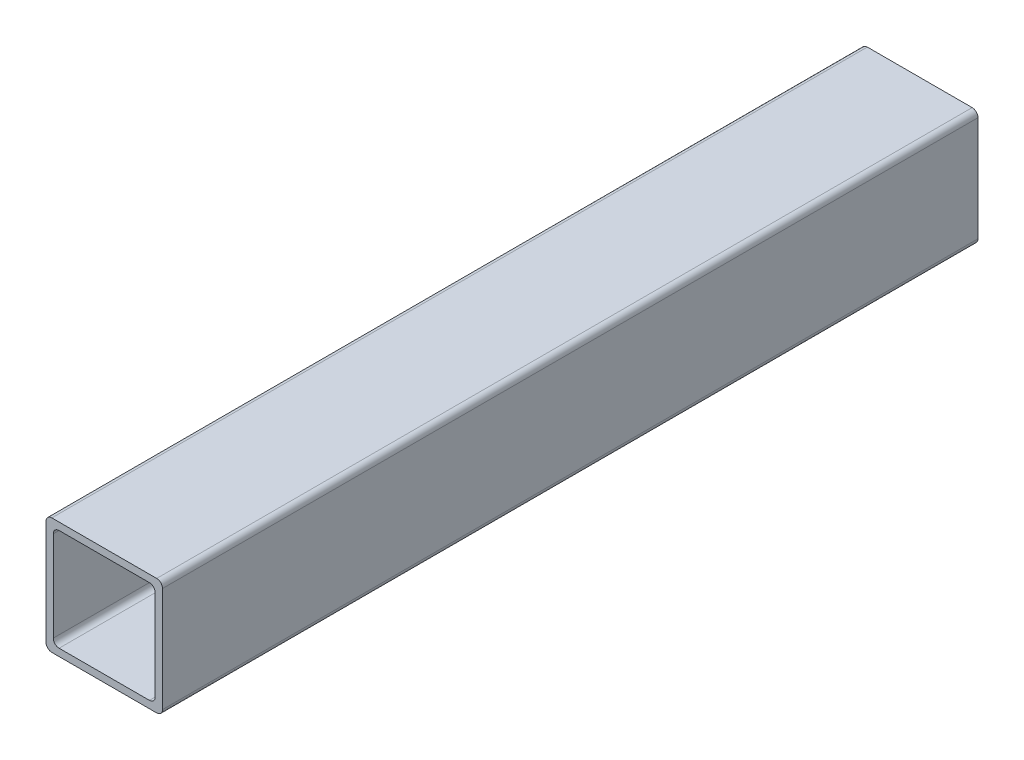
ISO-10303-21;
HEADER;
FILE_DESCRIPTION(('STEP AP214'),'2;1');
FILE_NAME('part.step','',(''),(''),'','','');
FILE_SCHEMA(('AUTOMOTIVE_DESIGN { 1 0 10303 214 1 1 1 1 }'));
ENDSEC;
DATA;
#1=APPLICATION_CONTEXT('core data for automotive mechanical design processes');
#2=APPLICATION_PROTOCOL_DEFINITION('international standard','automotive_design',2000,#1);
#3=PRODUCT_CONTEXT('',#1,'mechanical');
#4=PRODUCT('Part','Part','',(#3));
#5=PRODUCT_RELATED_PRODUCT_CATEGORY('part','',(#4));
#6=PRODUCT_DEFINITION_FORMATION('','',#4);
#7=PRODUCT_DEFINITION_CONTEXT('part definition',#1,'design');
#8=PRODUCT_DEFINITION('design','',#6,#7);
#9=PRODUCT_DEFINITION_SHAPE('','',#8);
#10=(LENGTH_UNIT() NAMED_UNIT(*) SI_UNIT(.MILLI.,.METRE.));
#11=(NAMED_UNIT(*) PLANE_ANGLE_UNIT() SI_UNIT($,.RADIAN.));
#12=(NAMED_UNIT(*) SI_UNIT($,.STERADIAN.) SOLID_ANGLE_UNIT());
#13=UNCERTAINTY_MEASURE_WITH_UNIT(LENGTH_MEASURE(1.E-05),#10,'distance_accuracy_value','');
#14=(GEOMETRIC_REPRESENTATION_CONTEXT(3) GLOBAL_UNCERTAINTY_ASSIGNED_CONTEXT((#13)) GLOBAL_UNIT_ASSIGNED_CONTEXT((#10,
#11,#12)) REPRESENTATION_CONTEXT('',''));
#15=CARTESIAN_POINT('',(0.,0.,0.));
#16=DIRECTION('',(0.,0.,1.));
#17=DIRECTION('',(1.,0.,0.));
#18=AXIS2_PLACEMENT_3D('',#15,#16,#17);
#19=CARTESIAN_POINT('',(22.86,-22.86,177.8));
#20=DIRECTION('',(0.,0.,1.));
#21=DIRECTION('',(1.,0.,0.));
#22=AXIS2_PLACEMENT_3D('',#19,#20,#21);
#23=PLANE('',#22);
#24=CARTESIAN_POINT('',(22.86,-22.86,177.8));
#25=DIRECTION('',(0.,0.,1.));
#26=DIRECTION('',(1.,0.,0.));
#27=AXIS2_PLACEMENT_3D('',#24,#25,#26);
#28=CIRCLE('',#27,2.54);
#29=CARTESIAN_POINT('',(22.86,-25.4,177.8));
#30=VERTEX_POINT('',#29);
#31=CARTESIAN_POINT('',(25.4,-22.86,177.8));
#32=VERTEX_POINT('',#31);
#33=EDGE_CURVE('E211',#30,#32,#28,.T.);
#34=ORIENTED_EDGE('',*,*,#33,.T.);
#35=DIRECTION('',(0.,1.,0.));
#36=VECTOR('',#35,1.);
#37=CARTESIAN_POINT('',(25.4,-22.86,177.8));
#38=LINE('',#37,#36);
#39=CARTESIAN_POINT('',(25.4,22.86,177.8));
#40=VERTEX_POINT('',#39);
#41=EDGE_CURVE('E214',#32,#40,#38,.T.);
#42=ORIENTED_EDGE('',*,*,#41,.T.);
#43=CARTESIAN_POINT('',(22.86,22.86,177.8));
#44=DIRECTION('',(0.,0.,1.));
#45=DIRECTION('',(-1.,0.,0.));
#46=AXIS2_PLACEMENT_3D('',#43,#44,#45);
#47=CIRCLE('',#46,2.54);
#48=CARTESIAN_POINT('',(22.86,25.4,177.8));
#49=VERTEX_POINT('',#48);
#50=EDGE_CURVE('E217',#40,#49,#47,.T.);
#51=ORIENTED_EDGE('',*,*,#50,.T.);
#52=DIRECTION('',(-1.,0.,0.));
#53=VECTOR('',#52,1.);
#54=CARTESIAN_POINT('',(-22.86,25.4,177.8));
#55=LINE('',#54,#53);
#56=CARTESIAN_POINT('',(-22.86,25.4,177.8));
#57=VERTEX_POINT('',#56);
#58=EDGE_CURVE('E219',#49,#57,#55,.T.);
#59=ORIENTED_EDGE('',*,*,#58,.T.);
#60=CARTESIAN_POINT('',(-22.86,22.86,177.8));
#61=DIRECTION('',(0.,0.,1.));
#62=DIRECTION('',(-1.,0.,0.));
#63=AXIS2_PLACEMENT_3D('',#60,#61,#62);
#64=CIRCLE('',#63,2.54);
#65=CARTESIAN_POINT('',(-25.4,22.86,177.8));
#66=VERTEX_POINT('',#65);
#67=EDGE_CURVE('E221',#57,#66,#64,.T.);
#68=ORIENTED_EDGE('',*,*,#67,.T.);
#69=DIRECTION('',(0.,-1.,0.));
#70=VECTOR('',#69,1.);
#71=CARTESIAN_POINT('',(-25.4,-22.86,177.8));
#72=LINE('',#71,#70);
#73=CARTESIAN_POINT('',(-25.4,-22.86,177.8));
#74=VERTEX_POINT('',#73);
#75=EDGE_CURVE('E223',#66,#74,#72,.T.);
#76=ORIENTED_EDGE('',*,*,#75,.T.);
#77=CARTESIAN_POINT('',(-22.86,-22.86,177.8));
#78=DIRECTION('',(0.,0.,1.));
#79=DIRECTION('',(-1.,0.,0.));
#80=AXIS2_PLACEMENT_3D('',#77,#78,#79);
#81=CIRCLE('',#80,2.54);
#82=CARTESIAN_POINT('',(-22.86,-25.4,177.8));
#83=VERTEX_POINT('',#82);
#84=EDGE_CURVE('E225',#74,#83,#81,.T.);
#85=ORIENTED_EDGE('',*,*,#84,.T.);
#86=DIRECTION('',(1.,0.,0.));
#87=VECTOR('',#86,1.);
#88=CARTESIAN_POINT('',(-22.86,-25.4,177.8));
#89=LINE('',#88,#87);
#90=EDGE_CURVE('E227',#83,#30,#89,.T.);
#91=ORIENTED_EDGE('',*,*,#90,.T.);
#92=EDGE_LOOP('',(#34,#42,#51,#59,#68,#76,#85,#91));
#93=FACE_BOUND('',#92,.T.);
#94=DIRECTION('',(-1.,0.,0.));
#95=VECTOR('',#94,1.);
#96=CARTESIAN_POINT('',(-19.685,22.225,177.8));
#97=LINE('',#96,#95);
#98=CARTESIAN_POINT('',(19.685,22.225,177.8));
#99=VERTEX_POINT('',#98);
#100=CARTESIAN_POINT('',(-19.685,22.225,177.8));
#101=VERTEX_POINT('',#100);
#102=EDGE_CURVE('E154',#99,#101,#97,.T.);
#103=ORIENTED_EDGE('',*,*,#102,.F.);
#104=CARTESIAN_POINT('',(19.685,19.685,177.8));
#105=DIRECTION('',(0.,0.,1.));
#106=DIRECTION('',(-1.,0.,0.));
#107=AXIS2_PLACEMENT_3D('',#104,#105,#106);
#108=CIRCLE('',#107,2.54);
#109=CARTESIAN_POINT('',(22.225,19.685,177.8));
#110=VERTEX_POINT('',#109);
#111=EDGE_CURVE('E146',#110,#99,#108,.T.);
#112=ORIENTED_EDGE('',*,*,#111,.F.);
#113=DIRECTION('',(0.,1.,0.));
#114=VECTOR('',#113,1.);
#115=CARTESIAN_POINT('',(22.225,-19.685,177.8));
#116=LINE('',#115,#114);
#117=CARTESIAN_POINT('',(22.225,-19.685,177.8));
#118=VERTEX_POINT('',#117);
#119=EDGE_CURVE('E179',#118,#110,#116,.T.);
#120=ORIENTED_EDGE('',*,*,#119,.F.);
#121=CARTESIAN_POINT('',(19.685,-19.685,177.8));
#122=DIRECTION('',(0.,0.,1.));
#123=DIRECTION('',(-1.,0.,0.));
#124=AXIS2_PLACEMENT_3D('',#121,#122,#123);
#125=CIRCLE('',#124,2.54);
#126=CARTESIAN_POINT('',(19.685,-22.225,177.8));
#127=VERTEX_POINT('',#126);
#128=EDGE_CURVE('E177',#127,#118,#125,.T.);
#129=ORIENTED_EDGE('',*,*,#128,.F.);
#130=DIRECTION('',(1.,0.,0.));
#131=VECTOR('',#130,1.);
#132=CARTESIAN_POINT('',(-19.685,-22.225,177.8));
#133=LINE('',#132,#131);
#134=CARTESIAN_POINT('',(-19.685,-22.225,177.8));
#135=VERTEX_POINT('',#134);
#136=EDGE_CURVE('E175',#135,#127,#133,.T.);
#137=ORIENTED_EDGE('',*,*,#136,.F.);
#138=CARTESIAN_POINT('',(-19.685,-19.685,177.8));
#139=DIRECTION('',(0.,0.,1.));
#140=DIRECTION('',(-1.,0.,0.));
#141=AXIS2_PLACEMENT_3D('',#138,#139,#140);
#142=CIRCLE('',#141,2.54);
#143=CARTESIAN_POINT('',(-22.225,-19.685,177.8));
#144=VERTEX_POINT('',#143);
#145=EDGE_CURVE('E173',#144,#135,#142,.T.);
#146=ORIENTED_EDGE('',*,*,#145,.F.);
#147=DIRECTION('',(0.,-1.,0.));
#148=VECTOR('',#147,1.);
#149=CARTESIAN_POINT('',(-22.225,-19.685,177.8));
#150=LINE('',#149,#148);
#151=CARTESIAN_POINT('',(-22.225,19.685,177.8));
#152=VERTEX_POINT('',#151);
#153=EDGE_CURVE('E169',#152,#144,#150,.T.);
#154=ORIENTED_EDGE('',*,*,#153,.F.);
#155=CARTESIAN_POINT('',(-19.685,19.685,177.8));
#156=DIRECTION('',(0.,0.,1.));
#157=DIRECTION('',(1.,0.,0.));
#158=AXIS2_PLACEMENT_3D('',#155,#156,#157);
#159=CIRCLE('',#158,2.54);
#160=EDGE_CURVE('E167',#101,#152,#159,.T.);
#161=ORIENTED_EDGE('',*,*,#160,.F.);
#162=EDGE_LOOP('',(#103,#112,#120,#129,#137,#146,#154,#161));
#163=FACE_BOUND('',#162,.T.);
#164=ADVANCED_FACE('F33',(#93,#163),#23,.T.);
#165=CARTESIAN_POINT('',(22.86,-22.86,-177.8));
#166=DIRECTION('',(0.,0.,1.));
#167=DIRECTION('',(1.,0.,0.));
#168=AXIS2_PLACEMENT_3D('',#165,#166,#167);
#169=PLANE('',#168);
#170=CARTESIAN_POINT('',(22.86,-22.86,-177.8));
#171=DIRECTION('',(0.,0.,1.));
#172=DIRECTION('',(1.,0.,0.));
#173=AXIS2_PLACEMENT_3D('',#170,#171,#172);
#174=CIRCLE('',#173,2.54);
#175=CARTESIAN_POINT('',(22.86,-25.4,-177.8));
#176=VERTEX_POINT('',#175);
#177=CARTESIAN_POINT('',(25.4,-22.86,-177.8));
#178=VERTEX_POINT('',#177);
#179=EDGE_CURVE('E162',#176,#178,#174,.T.);
#180=ORIENTED_EDGE('',*,*,#179,.F.);
#181=DIRECTION('',(1.,0.,0.));
#182=VECTOR('',#181,1.);
#183=CARTESIAN_POINT('',(-22.86,-25.4,-177.8));
#184=LINE('',#183,#182);
#185=CARTESIAN_POINT('',(-22.86,-25.4,-177.8));
#186=VERTEX_POINT('',#185);
#187=EDGE_CURVE('E215',#186,#176,#184,.T.);
#188=ORIENTED_EDGE('',*,*,#187,.F.);
#189=CARTESIAN_POINT('',(-22.86,-22.86,-177.8));
#190=DIRECTION('',(0.,0.,1.));
#191=DIRECTION('',(-1.,0.,0.));
#192=AXIS2_PLACEMENT_3D('',#189,#190,#191);
#193=CIRCLE('',#192,2.54);
#194=CARTESIAN_POINT('',(-25.4,-22.86,-177.8));
#195=VERTEX_POINT('',#194);
#196=EDGE_CURVE('E242',#195,#186,#193,.T.);
#197=ORIENTED_EDGE('',*,*,#196,.F.);
#198=DIRECTION('',(0.,-1.,0.));
#199=VECTOR('',#198,1.);
#200=CARTESIAN_POINT('',(-25.4,-22.86,-177.8));
#201=LINE('',#200,#199);
#202=CARTESIAN_POINT('',(-25.4,22.86,-177.8));
#203=VERTEX_POINT('',#202);
#204=EDGE_CURVE('E240',#203,#195,#201,.T.);
#205=ORIENTED_EDGE('',*,*,#204,.F.);
#206=CARTESIAN_POINT('',(-22.86,22.86,-177.8));
#207=DIRECTION('',(0.,0.,1.));
#208=DIRECTION('',(-1.,0.,0.));
#209=AXIS2_PLACEMENT_3D('',#206,#207,#208);
#210=CIRCLE('',#209,2.54);
#211=CARTESIAN_POINT('',(-22.86,25.4,-177.8));
#212=VERTEX_POINT('',#211);
#213=EDGE_CURVE('E238',#212,#203,#210,.T.);
#214=ORIENTED_EDGE('',*,*,#213,.F.);
#215=DIRECTION('',(-1.,0.,0.));
#216=VECTOR('',#215,1.);
#217=CARTESIAN_POINT('',(-22.86,25.4,-177.8));
#218=LINE('',#217,#216);
#219=CARTESIAN_POINT('',(22.86,25.4,-177.8));
#220=VERTEX_POINT('',#219);
#221=EDGE_CURVE('E236',#220,#212,#218,.T.);
#222=ORIENTED_EDGE('',*,*,#221,.F.);
#223=CARTESIAN_POINT('',(22.86,22.86,-177.8));
#224=DIRECTION('',(0.,0.,1.));
#225=DIRECTION('',(-1.,0.,0.));
#226=AXIS2_PLACEMENT_3D('',#223,#224,#225);
#227=CIRCLE('',#226,2.54);
#228=CARTESIAN_POINT('',(25.4,22.86,-177.8));
#229=VERTEX_POINT('',#228);
#230=EDGE_CURVE('E234',#229,#220,#227,.T.);
#231=ORIENTED_EDGE('',*,*,#230,.F.);
#232=DIRECTION('',(0.,1.,0.));
#233=VECTOR('',#232,1.);
#234=CARTESIAN_POINT('',(25.4,-22.86,-177.8));
#235=LINE('',#234,#233);
#236=EDGE_CURVE('E232',#178,#229,#235,.T.);
#237=ORIENTED_EDGE('',*,*,#236,.F.);
#238=EDGE_LOOP('',(#180,#188,#197,#205,#214,#222,#231,#237));
#239=FACE_BOUND('',#238,.T.);
#240=CARTESIAN_POINT('',(19.685,19.685,-177.8));
#241=DIRECTION('',(0.,0.,1.));
#242=DIRECTION('',(-1.,0.,0.));
#243=AXIS2_PLACEMENT_3D('',#240,#241,#242);
#244=CIRCLE('',#243,2.54);
#245=CARTESIAN_POINT('',(22.225,19.685,-177.8));
#246=VERTEX_POINT('',#245);
#247=CARTESIAN_POINT('',(19.685,22.225,-177.8));
#248=VERTEX_POINT('',#247);
#249=EDGE_CURVE('E56',#246,#248,#244,.T.);
#250=ORIENTED_EDGE('',*,*,#249,.T.);
#251=DIRECTION('',(-1.,0.,0.));
#252=VECTOR('',#251,1.);
#253=CARTESIAN_POINT('',(-19.685,22.225,-177.8));
#254=LINE('',#253,#252);
#255=CARTESIAN_POINT('',(-19.685,22.225,-177.8));
#256=VERTEX_POINT('',#255);
#257=EDGE_CURVE('E161',#248,#256,#254,.T.);
#258=ORIENTED_EDGE('',*,*,#257,.T.);
#259=CARTESIAN_POINT('',(-19.685,19.685,-177.8));
#260=DIRECTION('',(0.,0.,1.));
#261=DIRECTION('',(1.,0.,0.));
#262=AXIS2_PLACEMENT_3D('',#259,#260,#261);
#263=CIRCLE('',#262,2.54);
#264=CARTESIAN_POINT('',(-22.225,19.685,-177.8));
#265=VERTEX_POINT('',#264);
#266=EDGE_CURVE('E183',#256,#265,#263,.T.);
#267=ORIENTED_EDGE('',*,*,#266,.T.);
#268=DIRECTION('',(0.,-1.,0.));
#269=VECTOR('',#268,1.);
#270=CARTESIAN_POINT('',(-22.225,-19.685,-177.8));
#271=LINE('',#270,#269);
#272=CARTESIAN_POINT('',(-22.225,-19.685,-177.8));
#273=VERTEX_POINT('',#272);
#274=EDGE_CURVE('E186',#265,#273,#271,.T.);
#275=ORIENTED_EDGE('',*,*,#274,.T.);
#276=CARTESIAN_POINT('',(-19.685,-19.685,-177.8));
#277=DIRECTION('',(0.,0.,1.));
#278=DIRECTION('',(-1.,0.,0.));
#279=AXIS2_PLACEMENT_3D('',#276,#277,#278);
#280=CIRCLE('',#279,2.54);
#281=CARTESIAN_POINT('',(-19.685,-22.225,-177.8));
#282=VERTEX_POINT('',#281);
#283=EDGE_CURVE('E189',#273,#282,#280,.T.);
#284=ORIENTED_EDGE('',*,*,#283,.T.);
#285=DIRECTION('',(1.,0.,0.));
#286=VECTOR('',#285,1.);
#287=CARTESIAN_POINT('',(-19.685,-22.225,-177.8));
#288=LINE('',#287,#286);
#289=CARTESIAN_POINT('',(19.685,-22.225,-177.8));
#290=VERTEX_POINT('',#289);
#291=EDGE_CURVE('E192',#282,#290,#288,.T.);
#292=ORIENTED_EDGE('',*,*,#291,.T.);
#293=CARTESIAN_POINT('',(19.685,-19.685,-177.8));
#294=DIRECTION('',(0.,0.,1.));
#295=DIRECTION('',(-1.,0.,0.));
#296=AXIS2_PLACEMENT_3D('',#293,#294,#295);
#297=CIRCLE('',#296,2.54);
#298=CARTESIAN_POINT('',(22.225,-19.685,-177.8));
#299=VERTEX_POINT('',#298);
#300=EDGE_CURVE('E195',#290,#299,#297,.T.);
#301=ORIENTED_EDGE('',*,*,#300,.T.);
#302=DIRECTION('',(0.,1.,0.));
#303=VECTOR('',#302,1.);
#304=CARTESIAN_POINT('',(22.225,-19.685,-177.8));
#305=LINE('',#304,#303);
#306=EDGE_CURVE('E155',#299,#246,#305,.T.);
#307=ORIENTED_EDGE('',*,*,#306,.T.);
#308=EDGE_LOOP('',(#250,#258,#267,#275,#284,#292,#301,#307));
#309=FACE_BOUND('',#308,.T.);
#310=ADVANCED_FACE('F272',(#239,#309),#169,.F.);
#311=CARTESIAN_POINT('',(22.86,-22.86,177.8));
#312=DIRECTION('',(0.,0.,-1.));
#313=DIRECTION('',(-1.,0.,0.));
#314=AXIS2_PLACEMENT_3D('',#311,#312,#313);
#315=CYLINDRICAL_SURFACE('',#314,2.54);
#316=ORIENTED_EDGE('',*,*,#179,.T.);
#317=DIRECTION('',(0.,0.,-1.));
#318=VECTOR('',#317,1.);
#319=CARTESIAN_POINT('',(25.4,-22.86,177.8));
#320=LINE('',#319,#318);
#321=EDGE_CURVE('E11',#32,#178,#320,.T.);
#322=ORIENTED_EDGE('',*,*,#321,.F.);
#323=ORIENTED_EDGE('',*,*,#33,.F.);
#324=DIRECTION('',(0.,0.,-1.));
#325=VECTOR('',#324,1.);
#326=CARTESIAN_POINT('',(22.86,-25.4,177.8));
#327=LINE('',#326,#325);
#328=EDGE_CURVE('E229',#30,#176,#327,.T.);
#329=ORIENTED_EDGE('',*,*,#328,.T.);
#330=EDGE_LOOP('',(#316,#322,#323,#329));
#331=FACE_BOUND('',#330,.T.);
#332=ADVANCED_FACE('F35',(#331),#315,.T.);
#333=CARTESIAN_POINT('',(25.4,-22.86,177.8));
#334=DIRECTION('',(-1.,0.,0.));
#335=DIRECTION('',(0.,0.,1.));
#336=AXIS2_PLACEMENT_3D('',#333,#334,#335);
#337=PLANE('',#336);
#338=ORIENTED_EDGE('',*,*,#236,.T.);
#339=DIRECTION('',(0.,0.,-1.));
#340=VECTOR('',#339,1.);
#341=CARTESIAN_POINT('',(25.4,22.86,177.8));
#342=LINE('',#341,#340);
#343=EDGE_CURVE('E41',#40,#229,#342,.T.);
#344=ORIENTED_EDGE('',*,*,#343,.F.);
#345=ORIENTED_EDGE('',*,*,#41,.F.);
#346=ORIENTED_EDGE('',*,*,#321,.T.);
#347=EDGE_LOOP('',(#338,#344,#345,#346));
#348=FACE_BOUND('',#347,.T.);
#349=ADVANCED_FACE('F289',(#348),#337,.F.);
#350=CARTESIAN_POINT('',(22.86,22.86,177.8));
#351=DIRECTION('',(0.,0.,-1.));
#352=DIRECTION('',(-1.,0.,0.));
#353=AXIS2_PLACEMENT_3D('',#350,#351,#352);
#354=CYLINDRICAL_SURFACE('',#353,2.54);
#355=ORIENTED_EDGE('',*,*,#230,.T.);
#356=DIRECTION('',(0.,0.,-1.));
#357=VECTOR('',#356,1.);
#358=CARTESIAN_POINT('',(22.86,25.4,177.8));
#359=LINE('',#358,#357);
#360=EDGE_CURVE('E259',#49,#220,#359,.T.);
#361=ORIENTED_EDGE('',*,*,#360,.F.);
#362=ORIENTED_EDGE('',*,*,#50,.F.);
#363=ORIENTED_EDGE('',*,*,#343,.T.);
#364=EDGE_LOOP('',(#355,#361,#362,#363));
#365=FACE_BOUND('',#364,.T.);
#366=ADVANCED_FACE('F266',(#365),#354,.T.);
#367=CARTESIAN_POINT('',(-22.86,25.4,177.8));
#368=DIRECTION('',(0.,-1.,0.));
#369=DIRECTION('',(0.,0.,-1.));
#370=AXIS2_PLACEMENT_3D('',#367,#368,#369);
#371=PLANE('',#370);
#372=ORIENTED_EDGE('',*,*,#221,.T.);
#373=DIRECTION('',(0.,0.,-1.));
#374=VECTOR('',#373,1.);
#375=CARTESIAN_POINT('',(-22.86,25.4,177.8));
#376=LINE('',#375,#374);
#377=EDGE_CURVE('E256',#57,#212,#376,.T.);
#378=ORIENTED_EDGE('',*,*,#377,.F.);
#379=ORIENTED_EDGE('',*,*,#58,.F.);
#380=ORIENTED_EDGE('',*,*,#360,.T.);
#381=EDGE_LOOP('',(#372,#378,#379,#380));
#382=FACE_BOUND('',#381,.T.);
#383=ADVANCED_FACE('F278',(#382),#371,.F.);
#384=CARTESIAN_POINT('',(-22.86,22.86,177.8));
#385=DIRECTION('',(0.,0.,-1.));
#386=DIRECTION('',(-1.,0.,0.));
#387=AXIS2_PLACEMENT_3D('',#384,#385,#386);
#388=CYLINDRICAL_SURFACE('',#387,2.54);
#389=ORIENTED_EDGE('',*,*,#213,.T.);
#390=DIRECTION('',(0.,0.,-1.));
#391=VECTOR('',#390,1.);
#392=CARTESIAN_POINT('',(-25.4,22.86,177.8));
#393=LINE('',#392,#391);
#394=EDGE_CURVE('E253',#66,#203,#393,.T.);
#395=ORIENTED_EDGE('',*,*,#394,.F.);
#396=ORIENTED_EDGE('',*,*,#67,.F.);
#397=ORIENTED_EDGE('',*,*,#377,.T.);
#398=EDGE_LOOP('',(#389,#395,#396,#397));
#399=FACE_BOUND('',#398,.T.);
#400=ADVANCED_FACE('F282',(#399),#388,.T.);
#401=CARTESIAN_POINT('',(-25.4,-22.86,177.8));
#402=DIRECTION('',(1.,0.,0.));
#403=DIRECTION('',(0.,0.,-1.));
#404=AXIS2_PLACEMENT_3D('',#401,#402,#403);
#405=PLANE('',#404);
#406=ORIENTED_EDGE('',*,*,#204,.T.);
#407=DIRECTION('',(0.,0.,-1.));
#408=VECTOR('',#407,1.);
#409=CARTESIAN_POINT('',(-25.4,-22.86,177.8));
#410=LINE('',#409,#408);
#411=EDGE_CURVE('E250',#74,#195,#410,.T.);
#412=ORIENTED_EDGE('',*,*,#411,.F.);
#413=ORIENTED_EDGE('',*,*,#75,.F.);
#414=ORIENTED_EDGE('',*,*,#394,.T.);
#415=EDGE_LOOP('',(#406,#412,#413,#414));
#416=FACE_BOUND('',#415,.T.);
#417=ADVANCED_FACE('F302',(#416),#405,.F.);
#418=CARTESIAN_POINT('',(-22.86,-22.86,177.8));
#419=DIRECTION('',(0.,0.,-1.));
#420=DIRECTION('',(-1.,0.,0.));
#421=AXIS2_PLACEMENT_3D('',#418,#419,#420);
#422=CYLINDRICAL_SURFACE('',#421,2.54);
#423=ORIENTED_EDGE('',*,*,#196,.T.);
#424=DIRECTION('',(0.,0.,-1.));
#425=VECTOR('',#424,1.);
#426=CARTESIAN_POINT('',(-22.86,-25.4,177.8));
#427=LINE('',#426,#425);
#428=EDGE_CURVE('E247',#83,#186,#427,.T.);
#429=ORIENTED_EDGE('',*,*,#428,.F.);
#430=ORIENTED_EDGE('',*,*,#84,.F.);
#431=ORIENTED_EDGE('',*,*,#411,.T.);
#432=EDGE_LOOP('',(#423,#429,#430,#431));
#433=FACE_BOUND('',#432,.T.);
#434=ADVANCED_FACE('F300',(#433),#422,.T.);
#435=CARTESIAN_POINT('',(-22.86,-25.4,177.8));
#436=DIRECTION('',(0.,1.,0.));
#437=DIRECTION('',(0.,0.,1.));
#438=AXIS2_PLACEMENT_3D('',#435,#436,#437);
#439=PLANE('',#438);
#440=ORIENTED_EDGE('',*,*,#187,.T.);
#441=ORIENTED_EDGE('',*,*,#328,.F.);
#442=ORIENTED_EDGE('',*,*,#90,.F.);
#443=ORIENTED_EDGE('',*,*,#428,.T.);
#444=EDGE_LOOP('',(#440,#441,#442,#443));
#445=FACE_BOUND('',#444,.T.);
#446=ADVANCED_FACE('F295',(#445),#439,.F.);
#447=CARTESIAN_POINT('',(19.685,19.685,177.8));
#448=DIRECTION('',(0.,0.,-1.));
#449=DIRECTION('',(-1.,0.,0.));
#450=AXIS2_PLACEMENT_3D('',#447,#448,#449);
#451=CYLINDRICAL_SURFACE('',#450,2.54);
#452=ORIENTED_EDGE('',*,*,#249,.F.);
#453=DIRECTION('',(0.,0.,-1.));
#454=VECTOR('',#453,1.);
#455=CARTESIAN_POINT('',(22.225,19.685,177.8));
#456=LINE('',#455,#454);
#457=EDGE_CURVE('E150',#110,#246,#456,.T.);
#458=ORIENTED_EDGE('',*,*,#457,.F.);
#459=ORIENTED_EDGE('',*,*,#111,.T.);
#460=DIRECTION('',(0.,0.,-1.));
#461=VECTOR('',#460,1.);
#462=CARTESIAN_POINT('',(19.685,22.225,177.8));
#463=LINE('',#462,#461);
#464=EDGE_CURVE('E149',#99,#248,#463,.T.);
#465=ORIENTED_EDGE('',*,*,#464,.T.);
#466=EDGE_LOOP('',(#452,#458,#459,#465));
#467=FACE_BOUND('',#466,.T.);
#468=ADVANCED_FACE('F148',(#467),#451,.F.);
#469=CARTESIAN_POINT('',(-19.685,22.225,177.8));
#470=DIRECTION('',(0.,-1.,0.));
#471=DIRECTION('',(1.,0.,0.));
#472=AXIS2_PLACEMENT_3D('',#469,#470,#471);
#473=PLANE('',#472);
#474=ORIENTED_EDGE('',*,*,#257,.F.);
#475=ORIENTED_EDGE('',*,*,#464,.F.);
#476=ORIENTED_EDGE('',*,*,#102,.T.);
#477=DIRECTION('',(0.,0.,-1.));
#478=VECTOR('',#477,1.);
#479=CARTESIAN_POINT('',(-19.685,22.225,177.8));
#480=LINE('',#479,#478);
#481=EDGE_CURVE('E163',#101,#256,#480,.T.);
#482=ORIENTED_EDGE('',*,*,#481,.T.);
#483=EDGE_LOOP('',(#474,#475,#476,#482));
#484=FACE_BOUND('',#483,.T.);
#485=ADVANCED_FACE('F158',(#484),#473,.T.);
#486=CARTESIAN_POINT('',(-19.685,19.685,177.8));
#487=DIRECTION('',(0.,0.,-1.));
#488=DIRECTION('',(-1.,0.,0.));
#489=AXIS2_PLACEMENT_3D('',#486,#487,#488);
#490=CYLINDRICAL_SURFACE('',#489,2.54);
#491=ORIENTED_EDGE('',*,*,#266,.F.);
#492=ORIENTED_EDGE('',*,*,#481,.F.);
#493=ORIENTED_EDGE('',*,*,#160,.T.);
#494=DIRECTION('',(0.,0.,-1.));
#495=VECTOR('',#494,1.);
#496=CARTESIAN_POINT('',(-22.225,19.685,177.8));
#497=LINE('',#496,#495);
#498=EDGE_CURVE('E208',#152,#265,#497,.T.);
#499=ORIENTED_EDGE('',*,*,#498,.T.);
#500=EDGE_LOOP('',(#491,#492,#493,#499));
#501=FACE_BOUND('',#500,.T.);
#502=ADVANCED_FACE('F327',(#501),#490,.F.);
#503=CARTESIAN_POINT('',(-22.225,-19.685,177.8));
#504=DIRECTION('',(1.,0.,0.));
#505=DIRECTION('',(0.,0.,-1.));
#506=AXIS2_PLACEMENT_3D('',#503,#504,#505);
#507=PLANE('',#506);
#508=ORIENTED_EDGE('',*,*,#274,.F.);
#509=ORIENTED_EDGE('',*,*,#498,.F.);
#510=ORIENTED_EDGE('',*,*,#153,.T.);
#511=DIRECTION('',(0.,0.,-1.));
#512=VECTOR('',#511,1.);
#513=CARTESIAN_POINT('',(-22.225,-19.685,177.8));
#514=LINE('',#513,#512);
#515=EDGE_CURVE('E206',#144,#273,#514,.T.);
#516=ORIENTED_EDGE('',*,*,#515,.T.);
#517=EDGE_LOOP('',(#508,#509,#510,#516));
#518=FACE_BOUND('',#517,.T.);
#519=ADVANCED_FACE('F331',(#518),#507,.T.);
#520=CARTESIAN_POINT('',(-19.685,-19.685,177.8));
#521=DIRECTION('',(0.,0.,-1.));
#522=DIRECTION('',(-1.,0.,0.));
#523=AXIS2_PLACEMENT_3D('',#520,#521,#522);
#524=CYLINDRICAL_SURFACE('',#523,2.54);
#525=ORIENTED_EDGE('',*,*,#283,.F.);
#526=ORIENTED_EDGE('',*,*,#515,.F.);
#527=ORIENTED_EDGE('',*,*,#145,.T.);
#528=DIRECTION('',(0.,0.,-1.));
#529=VECTOR('',#528,1.);
#530=CARTESIAN_POINT('',(-19.685,-22.225,177.8));
#531=LINE('',#530,#529);
#532=EDGE_CURVE('E204',#135,#282,#531,.T.);
#533=ORIENTED_EDGE('',*,*,#532,.T.);
#534=EDGE_LOOP('',(#525,#526,#527,#533));
#535=FACE_BOUND('',#534,.T.);
#536=ADVANCED_FACE('F337',(#535),#524,.F.);
#537=CARTESIAN_POINT('',(-19.685,-22.225,177.8));
#538=DIRECTION('',(0.,1.,0.));
#539=DIRECTION('',(0.,0.,1.));
#540=AXIS2_PLACEMENT_3D('',#537,#538,#539);
#541=PLANE('',#540);
#542=ORIENTED_EDGE('',*,*,#291,.F.);
#543=ORIENTED_EDGE('',*,*,#532,.F.);
#544=ORIENTED_EDGE('',*,*,#136,.T.);
#545=DIRECTION('',(0.,0.,-1.));
#546=VECTOR('',#545,1.);
#547=CARTESIAN_POINT('',(19.685,-22.225,177.8));
#548=LINE('',#547,#546);
#549=EDGE_CURVE('E202',#127,#290,#548,.T.);
#550=ORIENTED_EDGE('',*,*,#549,.T.);
#551=EDGE_LOOP('',(#542,#543,#544,#550));
#552=FACE_BOUND('',#551,.T.);
#553=ADVANCED_FACE('F341',(#552),#541,.T.);
#554=CARTESIAN_POINT('',(19.685,-19.685,177.8));
#555=DIRECTION('',(0.,0.,-1.));
#556=DIRECTION('',(-1.,0.,0.));
#557=AXIS2_PLACEMENT_3D('',#554,#555,#556);
#558=CYLINDRICAL_SURFACE('',#557,2.54);
#559=ORIENTED_EDGE('',*,*,#300,.F.);
#560=ORIENTED_EDGE('',*,*,#549,.F.);
#561=ORIENTED_EDGE('',*,*,#128,.T.);
#562=DIRECTION('',(0.,0.,-1.));
#563=VECTOR('',#562,1.);
#564=CARTESIAN_POINT('',(22.225,-19.685,177.8));
#565=LINE('',#564,#563);
#566=EDGE_CURVE('E48',#118,#299,#565,.T.);
#567=ORIENTED_EDGE('',*,*,#566,.T.);
#568=EDGE_LOOP('',(#559,#560,#561,#567));
#569=FACE_BOUND('',#568,.T.);
#570=ADVANCED_FACE('F345',(#569),#558,.F.);
#571=CARTESIAN_POINT('',(22.225,-19.685,177.8));
#572=DIRECTION('',(-1.,0.,0.));
#573=DIRECTION('',(0.,-1.,0.));
#574=AXIS2_PLACEMENT_3D('',#571,#572,#573);
#575=PLANE('',#574);
#576=ORIENTED_EDGE('',*,*,#306,.F.);
#577=ORIENTED_EDGE('',*,*,#566,.F.);
#578=ORIENTED_EDGE('',*,*,#119,.T.);
#579=ORIENTED_EDGE('',*,*,#457,.T.);
#580=EDGE_LOOP('',(#576,#577,#578,#579));
#581=FACE_BOUND('',#580,.T.);
#582=ADVANCED_FACE('F349',(#581),#575,.T.);
#583=CLOSED_SHELL('',(#164,#310,#332,#349,#366,#383,#400,#417,#434,#446,#468,#485,#502,#519,
#536,#553,#570,#582));
#584=MANIFOLD_SOLID_BREP('B2',#583);
#585=ADVANCED_BREP_SHAPE_REPRESENTATION('',(#18,#584),#14);
#586=SHAPE_DEFINITION_REPRESENTATION(#9,#585);
ENDSEC;
END-ISO-10303-21;
